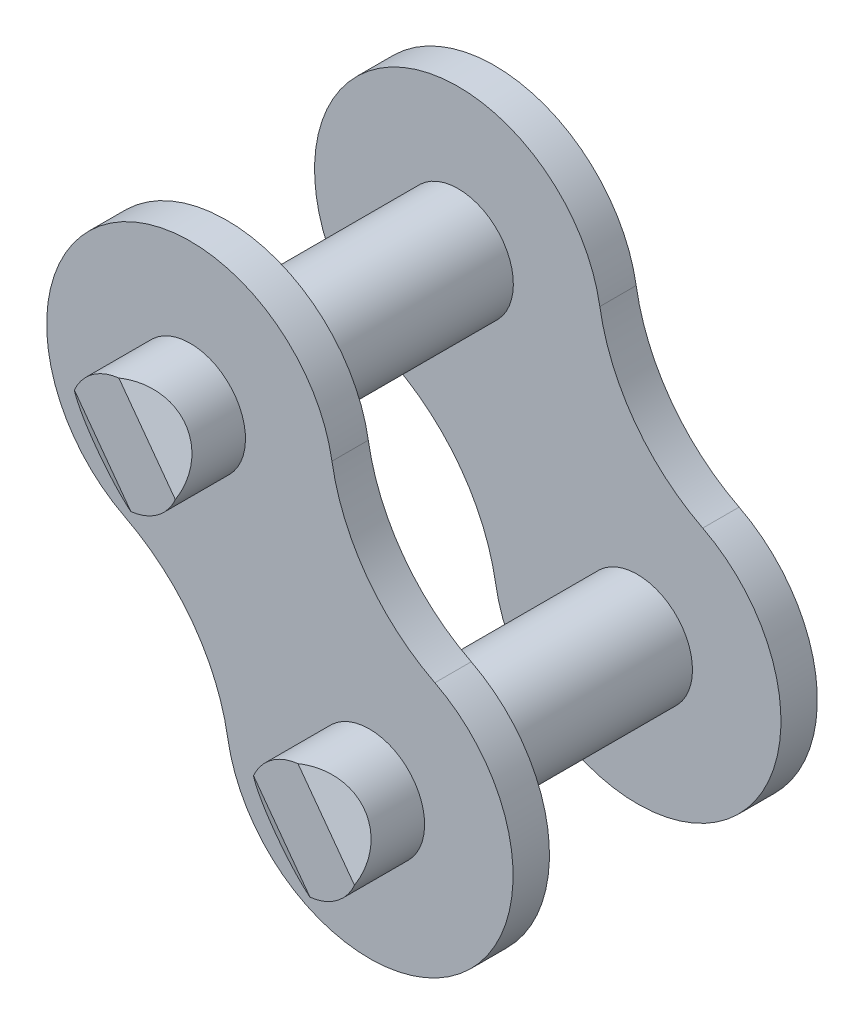
ISO-10303-21;
HEADER;
FILE_DESCRIPTION(('STEP AP214'),'2;1');
FILE_NAME('part.step','',(''),(''),'','','');
FILE_SCHEMA(('AUTOMOTIVE_DESIGN { 1 0 10303 214 1 1 1 1 }'));
ENDSEC;
DATA;
#1=APPLICATION_CONTEXT('core data for automotive mechanical design processes');
#2=APPLICATION_PROTOCOL_DEFINITION('international standard','automotive_design',2000,#1);
#3=PRODUCT_CONTEXT('',#1,'mechanical');
#4=PRODUCT('Part','Part','',(#3));
#5=PRODUCT_RELATED_PRODUCT_CATEGORY('part','',(#4));
#6=PRODUCT_DEFINITION_FORMATION('','',#4);
#7=PRODUCT_DEFINITION_CONTEXT('part definition',#1,'design');
#8=PRODUCT_DEFINITION('design','',#6,#7);
#9=PRODUCT_DEFINITION_SHAPE('','',#8);
#10=(LENGTH_UNIT() NAMED_UNIT(*) SI_UNIT(.MILLI.,.METRE.));
#11=(NAMED_UNIT(*) PLANE_ANGLE_UNIT() SI_UNIT($,.RADIAN.));
#12=(NAMED_UNIT(*) SI_UNIT($,.STERADIAN.) SOLID_ANGLE_UNIT());
#13=UNCERTAINTY_MEASURE_WITH_UNIT(LENGTH_MEASURE(1.E-05),#10,'distance_accuracy_value','');
#14=(GEOMETRIC_REPRESENTATION_CONTEXT(3) GLOBAL_UNCERTAINTY_ASSIGNED_CONTEXT((#13)) GLOBAL_UNIT_ASSIGNED_CONTEXT((#10,
#11,#12)) REPRESENTATION_CONTEXT('',''));
#15=CARTESIAN_POINT('',(0.,0.,0.));
#16=DIRECTION('',(0.,0.,1.));
#17=DIRECTION('',(1.,0.,0.));
#18=AXIS2_PLACEMENT_3D('',#15,#16,#17);
#19=CARTESIAN_POINT('',(97.5710510523382,74.9565436157474,-131.392489073474));
#20=DIRECTION('',(0.403276328607795,0.295581127247018,0.866025403784439));
#21=DIRECTION('',(0.591162254494036,-0.80655265721559,0.));
#22=AXIS2_PLACEMENT_3D('',#19,#20,#21);
#23=PLANE('',#22);
#24=CARTESIAN_POINT('',(89.6967262293112,87.1661063118109,-131.892921853051));
#25=DIRECTION('',(-0.403276328607794,-0.295581127247018,-0.866025403784439));
#26=DIRECTION('',(-0.698495090638544,-0.511961530150316,0.5));
#27=AXIS2_PLACEMENT_3D('',#24,#25,#26);
#28=ELLIPSE('',#27,1.3344874122049,1.1557);
#29=CARTESIAN_POINT('',(89.8223337167339,86.0172524268006,-131.5593));
#30=VERTEX_POINT('',#29);
#31=CARTESIAN_POINT('',(88.6389858359444,87.6317539793025,-131.5593));
#32=VERTEX_POINT('',#31);
#33=EDGE_CURVE('E275',#30,#32,#28,.T.);
#34=ORIENTED_EDGE('',*,*,#33,.T.);
#35=DIRECTION('',(-0.591162254494035,0.80655265721559,0.));
#36=VECTOR('',#35,1.);
#37=CARTESIAN_POINT('',(97.8040842788242,75.1273451701271,-131.5593));
#38=LINE('',#37,#36);
#39=EDGE_CURVE('E324',#30,#32,#38,.T.);
#40=ORIENTED_EDGE('',*,*,#39,.F.);
#41=EDGE_LOOP('',(#34,#40));
#42=FACE_BOUND('',#41,.T.);
#43=ADVANCED_FACE('F17',(#42),#23,.F.);
#44=CARTESIAN_POINT('',(98.9692504112543,75.9813529420256,-131.392489073474));
#45=DIRECTION('',(0.403276328607796,0.295581127247018,-0.866025403784438));
#46=DIRECTION('',(0.,-0.94639491673855,-0.323011859799966));
#47=AXIS2_PLACEMENT_3D('',#44,#45,#46);
#48=PLANE('',#47);
#49=CARTESIAN_POINT('',(89.6967262293112,87.1661063118109,-131.892921853051));
#50=DIRECTION('',(-0.403276328607795,-0.295581127247018,0.866025403784439));
#51=DIRECTION('',(0.698495090638544,0.511961530150315,0.5));
#52=AXIS2_PLACEMENT_3D('',#49,#50,#51);
#53=ELLIPSE('',#52,1.3344874122049,1.1557);
#54=CARTESIAN_POINT('',(90.7544666226779,86.7004586443193,-131.5593));
#55=VERTEX_POINT('',#54);
#56=CARTESIAN_POINT('',(89.5711187418885,88.3149601968213,-131.5593));
#57=VERTEX_POINT('',#56);
#58=EDGE_CURVE('E336',#55,#57,#53,.T.);
#59=ORIENTED_EDGE('',*,*,#58,.F.);
#60=DIRECTION('',(-0.591162254494035,0.80655265721559,0.));
#61=VECTOR('',#60,1.);
#62=CARTESIAN_POINT('',(98.7362171847683,75.8105513876459,-131.5593));
#63=LINE('',#62,#61);
#64=EDGE_CURVE('E327',#55,#57,#63,.T.);
#65=ORIENTED_EDGE('',*,*,#64,.T.);
#66=EDGE_LOOP('',(#59,#65));
#67=FACE_BOUND('',#66,.T.);
#68=ADVANCED_FACE('F456',(#67),#48,.T.);
#69=CARTESIAN_POINT('',(97.5710510523382,74.9565436157474,-131.392489073474));
#70=DIRECTION('',(0.403276328607795,0.295581127247018,0.866025403784439));
#71=DIRECTION('',(0.591162254494036,-0.80655265721559,0.));
#72=AXIS2_PLACEMENT_3D('',#69,#70,#71);
#73=PLANE('',#72);
#74=CARTESIAN_POINT('',(85.942845913274,92.2877156851299,-131.892921853051));
#75=DIRECTION('',(-0.403276328607794,-0.295581127247018,-0.866025403784439));
#76=DIRECTION('',(-0.698495090638544,-0.511961530150316,0.5));
#77=AXIS2_PLACEMENT_3D('',#74,#75,#76);
#78=ELLIPSE('',#77,1.3344874122049,1.1557);
#79=CARTESIAN_POINT('',(86.0684534006967,91.1388618001196,-131.5593));
#80=VERTEX_POINT('',#79);
#81=CARTESIAN_POINT('',(84.8851055199073,92.7533633526215,-131.5593));
#82=VERTEX_POINT('',#81);
#83=EDGE_CURVE('E353',#80,#82,#78,.T.);
#84=ORIENTED_EDGE('',*,*,#83,.T.);
#85=DIRECTION('',(-0.591162254494035,0.80655265721559,0.));
#86=VECTOR('',#85,1.);
#87=CARTESIAN_POINT('',(97.8040842788242,75.1273451701271,-131.5593));
#88=LINE('',#87,#86);
#89=EDGE_CURVE('E233',#80,#82,#88,.T.);
#90=ORIENTED_EDGE('',*,*,#89,.F.);
#91=EDGE_LOOP('',(#84,#90));
#92=FACE_BOUND('',#91,.T.);
#93=ADVANCED_FACE('F462',(#92),#73,.F.);
#94=CARTESIAN_POINT('',(98.9692504112543,75.9813529420256,-131.392489073474));
#95=DIRECTION('',(0.403276328607796,0.295581127247018,-0.866025403784438));
#96=DIRECTION('',(0.,-0.94639491673855,-0.323011859799966));
#97=AXIS2_PLACEMENT_3D('',#94,#95,#96);
#98=PLANE('',#97);
#99=CARTESIAN_POINT('',(85.942845913274,92.2877156851299,-131.892921853051));
#100=DIRECTION('',(-0.403276328607795,-0.295581127247018,0.866025403784439));
#101=DIRECTION('',(0.698495090638544,0.511961530150315,0.5));
#102=AXIS2_PLACEMENT_3D('',#99,#100,#101);
#103=ELLIPSE('',#102,1.3344874122049,1.1557);
#104=CARTESIAN_POINT('',(87.0005863066408,91.8220680176383,-131.5593));
#105=VERTEX_POINT('',#104);
#106=CARTESIAN_POINT('',(85.8172384258514,93.4365695701403,-131.5593));
#107=VERTEX_POINT('',#106);
#108=EDGE_CURVE('E234',#105,#107,#103,.T.);
#109=ORIENTED_EDGE('',*,*,#108,.F.);
#110=DIRECTION('',(-0.591162254494035,0.80655265721559,0.));
#111=VECTOR('',#110,1.);
#112=CARTESIAN_POINT('',(98.7362171847683,75.8105513876459,-131.5593));
#113=LINE('',#112,#111);
#114=EDGE_CURVE('E366',#105,#107,#113,.T.);
#115=ORIENTED_EDGE('',*,*,#114,.T.);
#116=EDGE_LOOP('',(#109,#115));
#117=FACE_BOUND('',#116,.T.);
#118=ADVANCED_FACE('F496',(#117),#98,.T.);
#119=CARTESIAN_POINT('',(87.8197860712926,89.7269109984704,-129.4257));
#120=DIRECTION('',(0.,0.,-1.));
#121=DIRECTION('',(0.,-1.,0.));
#122=AXIS2_PLACEMENT_3D('',#119,#120,#121);
#123=PLANE('',#122);
#124=CARTESIAN_POINT('',(89.6967262293112,87.1661063118109,-129.4257));
#125=DIRECTION('',(0.,0.,1.));
#126=DIRECTION('',(-0.591162254494035,0.80655265721559,0.));
#127=AXIS2_PLACEMENT_3D('',#124,#125,#126);
#128=CIRCLE('',#127,1.1557);
#129=CARTESIAN_POINT('',(89.0135200117924,88.098239217755,-129.4257));
#130=VERTEX_POINT('',#129);
#131=EDGE_CURVE('E309',#130,#130,#128,.T.);
#132=ORIENTED_EDGE('',*,*,#131,.F.);
#133=EDGE_LOOP('',(#132));
#134=FACE_BOUND('',#133,.T.);
#135=CARTESIAN_POINT('',(85.942845913274,92.2877156851299,-129.4257));
#136=DIRECTION('',(0.,0.,1.));
#137=DIRECTION('',(-0.591162254494035,0.80655265721559,0.));
#138=AXIS2_PLACEMENT_3D('',#135,#136,#137);
#139=CIRCLE('',#138,1.1557);
#140=CARTESIAN_POINT('',(85.2596396957552,93.219848591074,-129.4257));
#141=VERTEX_POINT('',#140);
#142=EDGE_CURVE('E323',#141,#141,#139,.T.);
#143=ORIENTED_EDGE('',*,*,#142,.F.);
#144=EDGE_LOOP('',(#143));
#145=FACE_BOUND('',#144,.T.);
#146=CARTESIAN_POINT('',(92.9188722489604,93.4642829526536,-129.4257));
#147=DIRECTION('',(0.,0.,1.));
#148=DIRECTION('',(-0.591162254494035,0.80655265721559,0.));
#149=AXIS2_PLACEMENT_3D('',#146,#147,#148);
#150=CIRCLE('',#149,4.06464973628698);
#151=CARTESIAN_POINT('',(88.9108286754961,92.788291686505,-129.4257));
#152=VERTEX_POINT('',#151);
#153=CARTESIAN_POINT('',(91.0676031990209,89.8456947772136,-129.4257));
#154=VERTEX_POINT('',#153);
#155=EDGE_CURVE('E369',#152,#154,#150,.T.);
#156=ORIENTED_EDGE('',*,*,#155,.F.);
#157=CARTESIAN_POINT('',(85.942845913274,92.2877156851299,-129.4257));
#158=DIRECTION('',(0.,0.,1.));
#159=DIRECTION('',(-0.591162254494035,0.80655265721559,0.));
#160=AXIS2_PLACEMENT_3D('',#157,#158,#159);
#161=CIRCLE('',#160,3.0099);
#162=CARTESIAN_POINT('',(84.5719689435643,89.6081272197272,-129.4257));
#163=VERTEX_POINT('',#162);
#164=EDGE_CURVE('E346',#152,#163,#161,.T.);
#165=ORIENTED_EDGE('',*,*,#164,.T.);
#166=CARTESIAN_POINT('',(82.7206998936249,85.9895390442873,-129.4257));
#167=DIRECTION('',(0.,0.,1.));
#168=DIRECTION('',(-0.591162254494035,0.80655265721559,0.));
#169=AXIS2_PLACEMENT_3D('',#166,#167,#168);
#170=CIRCLE('',#169,4.06464973628691);
#171=CARTESIAN_POINT('',(86.7287434670891,86.6655303104359,-129.4257));
#172=VERTEX_POINT('',#171);
#173=EDGE_CURVE('E216',#172,#163,#170,.T.);
#174=ORIENTED_EDGE('',*,*,#173,.F.);
#175=CARTESIAN_POINT('',(89.6967262293112,87.1661063118109,-129.4257));
#176=DIRECTION('',(0.,0.,1.));
#177=DIRECTION('',(-0.591162254494035,0.80655265721559,0.));
#178=AXIS2_PLACEMENT_3D('',#175,#176,#177);
#179=CIRCLE('',#178,3.0099);
#180=EDGE_CURVE('E20',#172,#154,#179,.T.);
#181=ORIENTED_EDGE('',*,*,#180,.T.);
#182=EDGE_LOOP('',(#156,#165,#174,#181));
#183=FACE_BOUND('',#182,.T.);
#184=ADVANCED_FACE('F398',(#134,#145,#183),#123,.F.);
#185=CARTESIAN_POINT('',(87.8197860712926,89.7269109984704,-130.1877));
#186=DIRECTION('',(0.,0.,-1.));
#187=DIRECTION('',(0.,-1.,0.));
#188=AXIS2_PLACEMENT_3D('',#185,#186,#187);
#189=PLANE('',#188);
#190=CARTESIAN_POINT('',(89.6967262293112,87.1661063118109,-130.1877));
#191=DIRECTION('',(0.,0.,1.));
#192=DIRECTION('',(-0.591162254494035,0.80655265721559,0.));
#193=AXIS2_PLACEMENT_3D('',#190,#191,#192);
#194=CIRCLE('',#193,1.1557);
#195=CARTESIAN_POINT('',(89.0135200117924,88.098239217755,-130.1877));
#196=VERTEX_POINT('',#195);
#197=EDGE_CURVE('E280',#196,#196,#194,.T.);
#198=ORIENTED_EDGE('',*,*,#197,.T.);
#199=EDGE_LOOP('',(#198));
#200=FACE_BOUND('',#199,.T.);
#201=CARTESIAN_POINT('',(85.942845913274,92.2877156851299,-130.1877));
#202=DIRECTION('',(0.,0.,1.));
#203=DIRECTION('',(-0.591162254494035,0.80655265721559,0.));
#204=AXIS2_PLACEMENT_3D('',#201,#202,#203);
#205=CIRCLE('',#204,1.1557);
#206=CARTESIAN_POINT('',(85.2596396957552,93.219848591074,-130.1877));
#207=VERTEX_POINT('',#206);
#208=EDGE_CURVE('E345',#207,#207,#205,.T.);
#209=ORIENTED_EDGE('',*,*,#208,.T.);
#210=EDGE_LOOP('',(#209));
#211=FACE_BOUND('',#210,.T.);
#212=CARTESIAN_POINT('',(92.9188722489604,93.4642829526536,-130.1877));
#213=DIRECTION('',(0.,0.,1.));
#214=DIRECTION('',(-0.591162254494035,0.80655265721559,0.));
#215=AXIS2_PLACEMENT_3D('',#212,#213,#214);
#216=CIRCLE('',#215,4.06464973628698);
#217=CARTESIAN_POINT('',(88.9108286754961,92.788291686505,-130.1877));
#218=VERTEX_POINT('',#217);
#219=CARTESIAN_POINT('',(91.0676031990209,89.8456947772136,-130.1877));
#220=VERTEX_POINT('',#219);
#221=EDGE_CURVE('E376',#218,#220,#216,.T.);
#222=ORIENTED_EDGE('',*,*,#221,.T.);
#223=CARTESIAN_POINT('',(89.6967262293112,87.1661063118109,-130.1877));
#224=DIRECTION('',(0.,0.,1.));
#225=DIRECTION('',(-0.591162254494035,0.80655265721559,0.));
#226=AXIS2_PLACEMENT_3D('',#223,#224,#225);
#227=CIRCLE('',#226,3.0099);
#228=CARTESIAN_POINT('',(86.7287434670891,86.6655303104359,-130.1877));
#229=VERTEX_POINT('',#228);
#230=EDGE_CURVE('E11',#229,#220,#227,.T.);
#231=ORIENTED_EDGE('',*,*,#230,.F.);
#232=CARTESIAN_POINT('',(82.7206998936249,85.9895390442873,-130.1877));
#233=DIRECTION('',(0.,0.,1.));
#234=DIRECTION('',(-0.591162254494035,0.80655265721559,0.));
#235=AXIS2_PLACEMENT_3D('',#232,#233,#234);
#236=CIRCLE('',#235,4.06464973628691);
#237=CARTESIAN_POINT('',(84.5719689435643,89.6081272197272,-130.1877));
#238=VERTEX_POINT('',#237);
#239=EDGE_CURVE('E385',#229,#238,#236,.T.);
#240=ORIENTED_EDGE('',*,*,#239,.T.);
#241=CARTESIAN_POINT('',(85.942845913274,92.2877156851299,-130.1877));
#242=DIRECTION('',(0.,0.,1.));
#243=DIRECTION('',(-0.591162254494035,0.80655265721559,0.));
#244=AXIS2_PLACEMENT_3D('',#241,#242,#243);
#245=CIRCLE('',#244,3.0099);
#246=EDGE_CURVE('E217',#218,#238,#245,.T.);
#247=ORIENTED_EDGE('',*,*,#246,.F.);
#248=EDGE_LOOP('',(#222,#231,#240,#247));
#249=FACE_BOUND('',#248,.T.);
#250=ADVANCED_FACE('F495',(#200,#211,#249),#189,.T.);
#251=CARTESIAN_POINT('',(89.6967262293112,87.1661063118109,-130.1877));
#252=DIRECTION('',(0.,0.,1.));
#253=DIRECTION('',(0.591162254494035,-0.80655265721559,0.));
#254=AXIS2_PLACEMENT_3D('',#251,#252,#253);
#255=CYLINDRICAL_SURFACE('',#254,3.0099);
#256=ORIENTED_EDGE('',*,*,#180,.F.);
#257=DIRECTION('',(0.,0.,1.));
#258=VECTOR('',#257,1.);
#259=CARTESIAN_POINT('',(86.7287434670891,86.6655303104359,-130.1877));
#260=LINE('',#259,#258);
#261=EDGE_CURVE('E387',#229,#172,#260,.T.);
#262=ORIENTED_EDGE('',*,*,#261,.F.);
#263=ORIENTED_EDGE('',*,*,#230,.T.);
#264=DIRECTION('',(0.,0.,1.));
#265=VECTOR('',#264,1.);
#266=CARTESIAN_POINT('',(91.0676031990209,89.8456947772136,-130.1877));
#267=LINE('',#266,#265);
#268=EDGE_CURVE('E373',#220,#154,#267,.T.);
#269=ORIENTED_EDGE('',*,*,#268,.T.);
#270=EDGE_LOOP('',(#256,#262,#263,#269));
#271=FACE_BOUND('',#270,.T.);
#272=ADVANCED_FACE('F400',(#271),#255,.T.);
#273=CARTESIAN_POINT('',(82.7206998936249,85.9895390442873,-130.1877));
#274=DIRECTION('',(0.,0.,1.));
#275=DIRECTION('',(0.591162254494035,-0.80655265721559,0.));
#276=AXIS2_PLACEMENT_3D('',#273,#274,#275);
#277=CYLINDRICAL_SURFACE('',#276,4.06464973628691);
#278=ORIENTED_EDGE('',*,*,#173,.T.);
#279=DIRECTION('',(0.,0.,1.));
#280=VECTOR('',#279,1.);
#281=CARTESIAN_POINT('',(84.5719689435643,89.6081272197272,-130.1877));
#282=LINE('',#281,#280);
#283=EDGE_CURVE('E214',#238,#163,#282,.T.);
#284=ORIENTED_EDGE('',*,*,#283,.F.);
#285=ORIENTED_EDGE('',*,*,#239,.F.);
#286=ORIENTED_EDGE('',*,*,#261,.T.);
#287=EDGE_LOOP('',(#278,#284,#285,#286));
#288=FACE_BOUND('',#287,.T.);
#289=ADVANCED_FACE('F408',(#288),#277,.F.);
#290=CARTESIAN_POINT('',(85.942845913274,92.2877156851299,-130.1877));
#291=DIRECTION('',(0.,0.,1.));
#292=DIRECTION('',(0.591162254494035,-0.80655265721559,0.));
#293=AXIS2_PLACEMENT_3D('',#290,#291,#292);
#294=CYLINDRICAL_SURFACE('',#293,3.0099);
#295=ORIENTED_EDGE('',*,*,#164,.F.);
#296=DIRECTION('',(0.,0.,1.));
#297=VECTOR('',#296,1.);
#298=CARTESIAN_POINT('',(88.9108286754961,92.788291686505,-130.1877));
#299=LINE('',#298,#297);
#300=EDGE_CURVE('E350',#218,#152,#299,.T.);
#301=ORIENTED_EDGE('',*,*,#300,.F.);
#302=ORIENTED_EDGE('',*,*,#246,.T.);
#303=ORIENTED_EDGE('',*,*,#283,.T.);
#304=EDGE_LOOP('',(#295,#301,#302,#303));
#305=FACE_BOUND('',#304,.T.);
#306=ADVANCED_FACE('F406',(#305),#294,.T.);
#307=CARTESIAN_POINT('',(92.9188722489604,93.4642829526536,-130.1877));
#308=DIRECTION('',(0.,0.,1.));
#309=DIRECTION('',(0.591162254494035,-0.80655265721559,0.));
#310=AXIS2_PLACEMENT_3D('',#307,#308,#309);
#311=CYLINDRICAL_SURFACE('',#310,4.06464973628698);
#312=ORIENTED_EDGE('',*,*,#155,.T.);
#313=ORIENTED_EDGE('',*,*,#268,.F.);
#314=ORIENTED_EDGE('',*,*,#221,.F.);
#315=ORIENTED_EDGE('',*,*,#300,.T.);
#316=EDGE_LOOP('',(#312,#313,#314,#315));
#317=FACE_BOUND('',#316,.T.);
#318=ADVANCED_FACE('F403',(#317),#311,.F.);
#319=CARTESIAN_POINT('',(87.8197860712926,89.7269109984704,-131.5593));
#320=DIRECTION('',(0.,0.,-1.));
#321=DIRECTION('',(0.,-1.,0.));
#322=AXIS2_PLACEMENT_3D('',#319,#320,#321);
#323=PLANE('',#322);
#324=ORIENTED_EDGE('',*,*,#89,.T.);
#325=CARTESIAN_POINT('',(85.942845913274,92.2877156851299,-131.5593));
#326=DIRECTION('',(0.,0.,1.));
#327=DIRECTION('',(-0.591162254494035,0.80655265721559,0.));
#328=AXIS2_PLACEMENT_3D('',#325,#326,#327);
#329=CIRCLE('',#328,1.1557);
#330=EDGE_CURVE('E229',#107,#82,#329,.T.);
#331=ORIENTED_EDGE('',*,*,#330,.F.);
#332=ORIENTED_EDGE('',*,*,#114,.F.);
#333=CARTESIAN_POINT('',(85.942845913274,92.2877156851299,-131.5593));
#334=DIRECTION('',(0.,0.,1.));
#335=DIRECTION('',(-0.591162254494035,0.80655265721559,0.));
#336=AXIS2_PLACEMENT_3D('',#333,#334,#335);
#337=CIRCLE('',#336,1.1557);
#338=EDGE_CURVE('E357',#80,#105,#337,.T.);
#339=ORIENTED_EDGE('',*,*,#338,.F.);
#340=EDGE_LOOP('',(#324,#331,#332,#339));
#341=FACE_BOUND('',#340,.T.);
#342=ADVANCED_FACE('F482',(#341),#323,.T.);
#343=CARTESIAN_POINT('',(85.942845913274,92.2877156851299,-131.5593));
#344=DIRECTION('',(0.,0.,1.));
#345=DIRECTION('',(0.591162254494035,-0.80655265721559,0.));
#346=AXIS2_PLACEMENT_3D('',#343,#344,#345);
#347=CYLINDRICAL_SURFACE('',#346,1.1557);
#348=ORIENTED_EDGE('',*,*,#83,.F.);
#349=ORIENTED_EDGE('',*,*,#338,.T.);
#350=ORIENTED_EDGE('',*,*,#108,.T.);
#351=ORIENTED_EDGE('',*,*,#330,.T.);
#352=EDGE_LOOP('',(#348,#349,#350,#351));
#353=FACE_BOUND('',#352,.T.);
#354=ORIENTED_EDGE('',*,*,#208,.F.);
#355=EDGE_LOOP('',(#354));
#356=FACE_BOUND('',#355,.T.);
#357=ADVANCED_FACE('F474',(#353,#356),#347,.T.);
#358=CARTESIAN_POINT('',(87.8197860712926,89.7269109984704,-131.5593));
#359=DIRECTION('',(0.,0.,-1.));
#360=DIRECTION('',(0.,-1.,0.));
#361=AXIS2_PLACEMENT_3D('',#358,#359,#360);
#362=PLANE('',#361);
#363=ORIENTED_EDGE('',*,*,#39,.T.);
#364=CARTESIAN_POINT('',(89.6967262293112,87.1661063118109,-131.5593));
#365=DIRECTION('',(0.,0.,1.));
#366=DIRECTION('',(-0.591162254494035,0.80655265721559,0.));
#367=AXIS2_PLACEMENT_3D('',#364,#365,#366);
#368=CIRCLE('',#367,1.1557);
#369=EDGE_CURVE('E328',#57,#32,#368,.T.);
#370=ORIENTED_EDGE('',*,*,#369,.F.);
#371=ORIENTED_EDGE('',*,*,#64,.F.);
#372=CARTESIAN_POINT('',(89.6967262293112,87.1661063118109,-131.5593));
#373=DIRECTION('',(0.,0.,1.));
#374=DIRECTION('',(-0.591162254494035,0.80655265721559,0.));
#375=AXIS2_PLACEMENT_3D('',#372,#373,#374);
#376=CIRCLE('',#375,1.1557);
#377=EDGE_CURVE('E279',#30,#55,#376,.T.);
#378=ORIENTED_EDGE('',*,*,#377,.F.);
#379=EDGE_LOOP('',(#363,#370,#371,#378));
#380=FACE_BOUND('',#379,.T.);
#381=ADVANCED_FACE('F472',(#380),#362,.T.);
#382=CARTESIAN_POINT('',(89.6967262293112,87.1661063118109,-131.5593));
#383=DIRECTION('',(0.,0.,1.));
#384=DIRECTION('',(0.591162254494035,-0.80655265721559,0.));
#385=AXIS2_PLACEMENT_3D('',#382,#383,#384);
#386=CYLINDRICAL_SURFACE('',#385,1.1557);
#387=ORIENTED_EDGE('',*,*,#33,.F.);
#388=ORIENTED_EDGE('',*,*,#377,.T.);
#389=ORIENTED_EDGE('',*,*,#58,.T.);
#390=ORIENTED_EDGE('',*,*,#369,.T.);
#391=EDGE_LOOP('',(#387,#388,#389,#390));
#392=FACE_BOUND('',#391,.T.);
#393=ORIENTED_EDGE('',*,*,#197,.F.);
#394=EDGE_LOOP('',(#393));
#395=FACE_BOUND('',#394,.T.);
#396=ADVANCED_FACE('F467',(#392,#395),#386,.T.);
#397=CARTESIAN_POINT('',(97.5710510523382,74.9565436157474,-122.607510926526));
#398=DIRECTION('',(0.403276328607795,0.295581127247018,-0.866025403784439));
#399=DIRECTION('',(0.,-0.94639491673855,-0.323011859799966));
#400=AXIS2_PLACEMENT_3D('',#397,#398,#399);
#401=PLANE('',#400);
#402=CARTESIAN_POINT('',(89.6967262293112,87.1661063118109,-122.107078146949));
#403=DIRECTION('',(0.403276328607794,0.295581127247018,-0.866025403784439));
#404=DIRECTION('',(-0.698495090638544,-0.511961530150316,-0.5));
#405=AXIS2_PLACEMENT_3D('',#402,#403,#404);
#406=ELLIPSE('',#405,1.3344874122049,1.1557);
#407=CARTESIAN_POINT('',(89.8223337167339,86.0172524268006,-122.4407));
#408=VERTEX_POINT('',#407);
#409=CARTESIAN_POINT('',(88.6389858359444,87.6317539793025,-122.4407));
#410=VERTEX_POINT('',#409);
#411=EDGE_CURVE('E201',#408,#410,#406,.T.);
#412=ORIENTED_EDGE('',*,*,#411,.F.);
#413=DIRECTION('',(-0.591162254494035,0.80655265721559,0.));
#414=VECTOR('',#413,1.);
#415=CARTESIAN_POINT('',(97.8040842788242,75.1273451701271,-122.4407));
#416=LINE('',#415,#414);
#417=EDGE_CURVE('E248',#408,#410,#416,.T.);
#418=ORIENTED_EDGE('',*,*,#417,.T.);
#419=EDGE_LOOP('',(#412,#418));
#420=FACE_BOUND('',#419,.T.);
#421=ADVANCED_FACE('F480',(#420),#401,.F.);
#422=CARTESIAN_POINT('',(98.9692504112543,75.9813529420256,-122.607510926526));
#423=DIRECTION('',(0.403276328607796,0.295581127247018,0.866025403784438));
#424=DIRECTION('',(0.591162254494035,-0.806552657215591,0.));
#425=AXIS2_PLACEMENT_3D('',#422,#423,#424);
#426=PLANE('',#425);
#427=CARTESIAN_POINT('',(89.6967262293112,87.1661063118109,-122.107078146949));
#428=DIRECTION('',(0.403276328607795,0.295581127247018,0.866025403784439));
#429=DIRECTION('',(0.698495090638544,0.511961530150315,-0.5));
#430=AXIS2_PLACEMENT_3D('',#427,#428,#429);
#431=ELLIPSE('',#430,1.3344874122049,1.1557);
#432=CARTESIAN_POINT('',(90.7544666226779,86.7004586443193,-122.4407));
#433=VERTEX_POINT('',#432);
#434=CARTESIAN_POINT('',(89.5711187418885,88.3149601968213,-122.4407));
#435=VERTEX_POINT('',#434);
#436=EDGE_CURVE('E228',#433,#435,#431,.T.);
#437=ORIENTED_EDGE('',*,*,#436,.T.);
#438=DIRECTION('',(-0.591162254494035,0.80655265721559,0.));
#439=VECTOR('',#438,1.);
#440=CARTESIAN_POINT('',(98.7362171847683,75.8105513876459,-122.4407));
#441=LINE('',#440,#439);
#442=EDGE_CURVE('E251',#433,#435,#441,.T.);
#443=ORIENTED_EDGE('',*,*,#442,.F.);
#444=EDGE_LOOP('',(#437,#443));
#445=FACE_BOUND('',#444,.T.);
#446=ADVANCED_FACE('F530',(#445),#426,.T.);
#447=CARTESIAN_POINT('',(97.5710510523382,74.9565436157474,-122.607510926526));
#448=DIRECTION('',(0.403276328607795,0.295581127247018,-0.866025403784439));
#449=DIRECTION('',(0.,-0.94639491673855,-0.323011859799966));
#450=AXIS2_PLACEMENT_3D('',#447,#448,#449);
#451=PLANE('',#450);
#452=CARTESIAN_POINT('',(85.942845913274,92.2877156851299,-122.107078146949));
#453=DIRECTION('',(0.403276328607794,0.295581127247018,-0.866025403784439));
#454=DIRECTION('',(-0.698495090638544,-0.511961530150316,-0.5));
#455=AXIS2_PLACEMENT_3D('',#452,#453,#454);
#456=ELLIPSE('',#455,1.3344874122049,1.1557);
#457=CARTESIAN_POINT('',(86.0684534006967,91.1388618001196,-122.4407));
#458=VERTEX_POINT('',#457);
#459=CARTESIAN_POINT('',(84.8851055199073,92.7533633526215,-122.4407));
#460=VERTEX_POINT('',#459);
#461=EDGE_CURVE('E224',#458,#460,#456,.T.);
#462=ORIENTED_EDGE('',*,*,#461,.F.);
#463=DIRECTION('',(-0.591162254494035,0.80655265721559,0.));
#464=VECTOR('',#463,1.);
#465=CARTESIAN_POINT('',(97.8040842788242,75.1273451701271,-122.4407));
#466=LINE('',#465,#464);
#467=EDGE_CURVE('E273',#458,#460,#466,.T.);
#468=ORIENTED_EDGE('',*,*,#467,.T.);
#469=EDGE_LOOP('',(#462,#468));
#470=FACE_BOUND('',#469,.T.);
#471=ADVANCED_FACE('F539',(#470),#451,.F.);
#472=CARTESIAN_POINT('',(98.9692504112543,75.9813529420256,-122.607510926526));
#473=DIRECTION('',(0.403276328607796,0.295581127247018,0.866025403784438));
#474=DIRECTION('',(0.591162254494035,-0.806552657215591,0.));
#475=AXIS2_PLACEMENT_3D('',#472,#473,#474);
#476=PLANE('',#475);
#477=CARTESIAN_POINT('',(85.942845913274,92.2877156851299,-122.107078146949));
#478=DIRECTION('',(0.403276328607795,0.295581127247018,0.866025403784439));
#479=DIRECTION('',(0.698495090638544,0.511961530150315,-0.5));
#480=AXIS2_PLACEMENT_3D('',#477,#478,#479);
#481=ELLIPSE('',#480,1.3344874122049,1.1557);
#482=CARTESIAN_POINT('',(87.0005863066408,91.8220680176383,-122.4407));
#483=VERTEX_POINT('',#482);
#484=CARTESIAN_POINT('',(85.8172384258514,93.4365695701403,-122.4407));
#485=VERTEX_POINT('',#484);
#486=EDGE_CURVE('E223',#483,#485,#481,.T.);
#487=ORIENTED_EDGE('',*,*,#486,.T.);
#488=DIRECTION('',(-0.591162254494035,0.80655265721559,0.));
#489=VECTOR('',#488,1.);
#490=CARTESIAN_POINT('',(98.7362171847683,75.8105513876459,-122.4407));
#491=LINE('',#490,#489);
#492=EDGE_CURVE('E240',#483,#485,#491,.T.);
#493=ORIENTED_EDGE('',*,*,#492,.F.);
#494=EDGE_LOOP('',(#487,#493));
#495=FACE_BOUND('',#494,.T.);
#496=ADVANCED_FACE('F535',(#495),#476,.T.);
#497=CARTESIAN_POINT('',(89.6967262293112,87.1661063118109,-122.4407));
#498=DIRECTION('',(0.,0.,-1.));
#499=DIRECTION('',(0.591162254494035,-0.80655265721559,0.));
#500=AXIS2_PLACEMENT_3D('',#497,#498,#499);
#501=CYLINDRICAL_SURFACE('',#500,1.1557);
#502=ORIENTED_EDGE('',*,*,#131,.T.);
#503=EDGE_LOOP('',(#502));
#504=FACE_BOUND('',#503,.T.);
#505=CARTESIAN_POINT('',(89.6967262293112,87.1661063118109,-124.5743));
#506=DIRECTION('',(0.,0.,1.));
#507=DIRECTION('',(-0.591162254494035,0.80655265721559,0.));
#508=AXIS2_PLACEMENT_3D('',#505,#506,#507);
#509=CIRCLE('',#508,1.1557);
#510=CARTESIAN_POINT('',(89.0135200117924,88.098239217755,-124.5743));
#511=VERTEX_POINT('',#510);
#512=EDGE_CURVE('E320',#511,#511,#509,.T.);
#513=ORIENTED_EDGE('',*,*,#512,.F.);
#514=EDGE_LOOP('',(#513));
#515=FACE_BOUND('',#514,.T.);
#516=ADVANCED_FACE('F449',(#504,#515),#501,.T.);
#517=CARTESIAN_POINT('',(85.942845913274,92.2877156851299,-122.4407));
#518=DIRECTION('',(0.,0.,-1.));
#519=DIRECTION('',(0.591162254494035,-0.80655265721559,0.));
#520=AXIS2_PLACEMENT_3D('',#517,#518,#519);
#521=CYLINDRICAL_SURFACE('',#520,1.1557);
#522=ORIENTED_EDGE('',*,*,#142,.T.);
#523=EDGE_LOOP('',(#522));
#524=FACE_BOUND('',#523,.T.);
#525=CARTESIAN_POINT('',(85.942845913274,92.2877156851299,-124.5743));
#526=DIRECTION('',(0.,0.,1.));
#527=DIRECTION('',(-0.591162254494035,0.80655265721559,0.));
#528=AXIS2_PLACEMENT_3D('',#525,#526,#527);
#529=CIRCLE('',#528,1.1557);
#530=CARTESIAN_POINT('',(85.2596396957552,93.219848591074,-124.5743));
#531=VERTEX_POINT('',#530);
#532=EDGE_CURVE('E284',#531,#531,#529,.T.);
#533=ORIENTED_EDGE('',*,*,#532,.F.);
#534=EDGE_LOOP('',(#533));
#535=FACE_BOUND('',#534,.T.);
#536=ADVANCED_FACE('F441',(#524,#535),#521,.T.);
#537=CARTESIAN_POINT('',(87.8197860712926,89.7269109984704,-124.5743));
#538=DIRECTION('',(0.,0.,1.));
#539=DIRECTION('',(1.,0.,0.));
#540=AXIS2_PLACEMENT_3D('',#537,#538,#539);
#541=PLANE('',#540);
#542=ORIENTED_EDGE('',*,*,#512,.T.);
#543=EDGE_LOOP('',(#542));
#544=FACE_BOUND('',#543,.T.);
#545=ORIENTED_EDGE('',*,*,#532,.T.);
#546=EDGE_LOOP('',(#545));
#547=FACE_BOUND('',#546,.T.);
#548=CARTESIAN_POINT('',(92.9188722489604,93.4642829526536,-124.5743));
#549=DIRECTION('',(0.,0.,1.));
#550=DIRECTION('',(-0.591162254494035,0.80655265721559,0.));
#551=AXIS2_PLACEMENT_3D('',#548,#549,#550);
#552=CIRCLE('',#551,4.06464973628698);
#553=CARTESIAN_POINT('',(88.9108286754961,92.788291686505,-124.5743));
#554=VERTEX_POINT('',#553);
#555=CARTESIAN_POINT('',(91.0676031990209,89.8456947772136,-124.5743));
#556=VERTEX_POINT('',#555);
#557=EDGE_CURVE('E235',#554,#556,#552,.T.);
#558=ORIENTED_EDGE('',*,*,#557,.T.);
#559=CARTESIAN_POINT('',(89.6967262293112,87.1661063118109,-124.5743));
#560=DIRECTION('',(0.,0.,1.));
#561=DIRECTION('',(-0.591162254494035,0.80655265721559,0.));
#562=AXIS2_PLACEMENT_3D('',#559,#560,#561);
#563=CIRCLE('',#562,3.0099);
#564=CARTESIAN_POINT('',(86.7287434670891,86.6655303104359,-124.5743));
#565=VERTEX_POINT('',#564);
#566=EDGE_CURVE('E285',#565,#556,#563,.T.);
#567=ORIENTED_EDGE('',*,*,#566,.F.);
#568=CARTESIAN_POINT('',(82.7206998936249,85.9895390442873,-124.5743));
#569=DIRECTION('',(0.,0.,1.));
#570=DIRECTION('',(-0.591162254494035,0.80655265721559,0.));
#571=AXIS2_PLACEMENT_3D('',#568,#569,#570);
#572=CIRCLE('',#571,4.06464973628691);
#573=CARTESIAN_POINT('',(84.5719689435643,89.6081272197272,-124.5743));
#574=VERTEX_POINT('',#573);
#575=EDGE_CURVE('E303',#565,#574,#572,.T.);
#576=ORIENTED_EDGE('',*,*,#575,.T.);
#577=CARTESIAN_POINT('',(85.942845913274,92.2877156851299,-124.5743));
#578=DIRECTION('',(0.,0.,1.));
#579=DIRECTION('',(-0.591162254494035,0.80655265721559,0.));
#580=AXIS2_PLACEMENT_3D('',#577,#578,#579);
#581=CIRCLE('',#580,3.0099);
#582=EDGE_CURVE('E252',#554,#574,#581,.T.);
#583=ORIENTED_EDGE('',*,*,#582,.F.);
#584=EDGE_LOOP('',(#558,#567,#576,#583));
#585=FACE_BOUND('',#584,.T.);
#586=ADVANCED_FACE('F422',(#544,#547,#585),#541,.F.);
#587=CARTESIAN_POINT('',(87.8197860712926,89.7269109984704,-123.8123));
#588=DIRECTION('',(0.,0.,1.));
#589=DIRECTION('',(1.,0.,0.));
#590=AXIS2_PLACEMENT_3D('',#587,#588,#589);
#591=PLANE('',#590);
#592=CARTESIAN_POINT('',(89.6967262293112,87.1661063118109,-123.8123));
#593=DIRECTION('',(0.,0.,1.));
#594=DIRECTION('',(-0.591162254494035,0.80655265721559,0.));
#595=AXIS2_PLACEMENT_3D('',#592,#593,#594);
#596=CIRCLE('',#595,1.1557);
#597=CARTESIAN_POINT('',(89.0135200117924,88.098239217755,-123.8123));
#598=VERTEX_POINT('',#597);
#599=EDGE_CURVE('E197',#598,#598,#596,.T.);
#600=ORIENTED_EDGE('',*,*,#599,.F.);
#601=EDGE_LOOP('',(#600));
#602=FACE_BOUND('',#601,.T.);
#603=CARTESIAN_POINT('',(85.942845913274,92.2877156851299,-123.8123));
#604=DIRECTION('',(0.,0.,1.));
#605=DIRECTION('',(-0.591162254494035,0.80655265721559,0.));
#606=AXIS2_PLACEMENT_3D('',#603,#604,#605);
#607=CIRCLE('',#606,1.1557);
#608=CARTESIAN_POINT('',(85.2596396957552,93.219848591074,-123.8123));
#609=VERTEX_POINT('',#608);
#610=EDGE_CURVE('E212',#609,#609,#607,.T.);
#611=ORIENTED_EDGE('',*,*,#610,.F.);
#612=EDGE_LOOP('',(#611));
#613=FACE_BOUND('',#612,.T.);
#614=CARTESIAN_POINT('',(92.9188722489604,93.4642829526536,-123.8123));
#615=DIRECTION('',(0.,0.,1.));
#616=DIRECTION('',(-0.591162254494035,0.80655265721559,0.));
#617=AXIS2_PLACEMENT_3D('',#614,#615,#616);
#618=CIRCLE('',#617,4.06464973628698);
#619=CARTESIAN_POINT('',(88.9108286754961,92.788291686505,-123.8123));
#620=VERTEX_POINT('',#619);
#621=CARTESIAN_POINT('',(91.0676031990209,89.8456947772136,-123.8123));
#622=VERTEX_POINT('',#621);
#623=EDGE_CURVE('E266',#620,#622,#618,.T.);
#624=ORIENTED_EDGE('',*,*,#623,.F.);
#625=CARTESIAN_POINT('',(85.942845913274,92.2877156851299,-123.8123));
#626=DIRECTION('',(0.,0.,1.));
#627=DIRECTION('',(-0.591162254494035,0.80655265721559,0.));
#628=AXIS2_PLACEMENT_3D('',#625,#626,#627);
#629=CIRCLE('',#628,3.0099);
#630=CARTESIAN_POINT('',(84.5719689435643,89.6081272197272,-123.8123));
#631=VERTEX_POINT('',#630);
#632=EDGE_CURVE('E299',#620,#631,#629,.T.);
#633=ORIENTED_EDGE('',*,*,#632,.T.);
#634=CARTESIAN_POINT('',(82.7206998936249,85.9895390442873,-123.8123));
#635=DIRECTION('',(0.,0.,1.));
#636=DIRECTION('',(-0.591162254494035,0.80655265721559,0.));
#637=AXIS2_PLACEMENT_3D('',#634,#635,#636);
#638=CIRCLE('',#637,4.06464973628691);
#639=CARTESIAN_POINT('',(86.7287434670891,86.6655303104359,-123.8123));
#640=VERTEX_POINT('',#639);
#641=EDGE_CURVE('E313',#640,#631,#638,.T.);
#642=ORIENTED_EDGE('',*,*,#641,.F.);
#643=CARTESIAN_POINT('',(89.6967262293112,87.1661063118109,-123.8123));
#644=DIRECTION('',(0.,0.,1.));
#645=DIRECTION('',(-0.591162254494035,0.80655265721559,0.));
#646=AXIS2_PLACEMENT_3D('',#643,#644,#645);
#647=CIRCLE('',#646,3.0099);
#648=EDGE_CURVE('E281',#640,#622,#647,.T.);
#649=ORIENTED_EDGE('',*,*,#648,.T.);
#650=EDGE_LOOP('',(#624,#633,#642,#649));
#651=FACE_BOUND('',#650,.T.);
#652=ADVANCED_FACE('F418',(#602,#613,#651),#591,.T.);
#653=CARTESIAN_POINT('',(89.6967262293112,87.1661063118109,-123.8123));
#654=DIRECTION('',(0.,0.,-1.));
#655=DIRECTION('',(0.591162254494035,-0.80655265721559,0.));
#656=AXIS2_PLACEMENT_3D('',#653,#654,#655);
#657=CYLINDRICAL_SURFACE('',#656,3.0099);
#658=ORIENTED_EDGE('',*,*,#566,.T.);
#659=DIRECTION('',(0.,0.,-1.));
#660=VECTOR('',#659,1.);
#661=CARTESIAN_POINT('',(91.0676031990209,89.8456947772136,-123.8123));
#662=LINE('',#661,#660);
#663=EDGE_CURVE('E257',#622,#556,#662,.T.);
#664=ORIENTED_EDGE('',*,*,#663,.F.);
#665=ORIENTED_EDGE('',*,*,#648,.F.);
#666=DIRECTION('',(0.,0.,-1.));
#667=VECTOR('',#666,1.);
#668=CARTESIAN_POINT('',(86.7287434670891,86.6655303104359,-123.8123));
#669=LINE('',#668,#667);
#670=EDGE_CURVE('E306',#640,#565,#669,.T.);
#671=ORIENTED_EDGE('',*,*,#670,.T.);
#672=EDGE_LOOP('',(#658,#664,#665,#671));
#673=FACE_BOUND('',#672,.T.);
#674=ADVANCED_FACE('F421',(#673),#657,.T.);
#675=CARTESIAN_POINT('',(82.7206998936249,85.9895390442873,-123.8123));
#676=DIRECTION('',(0.,0.,-1.));
#677=DIRECTION('',(0.591162254494035,-0.80655265721559,0.));
#678=AXIS2_PLACEMENT_3D('',#675,#676,#677);
#679=CYLINDRICAL_SURFACE('',#678,4.06464973628691);
#680=ORIENTED_EDGE('',*,*,#575,.F.);
#681=ORIENTED_EDGE('',*,*,#670,.F.);
#682=ORIENTED_EDGE('',*,*,#641,.T.);
#683=DIRECTION('',(0.,0.,-1.));
#684=VECTOR('',#683,1.);
#685=CARTESIAN_POINT('',(84.5719689435643,89.6081272197272,-123.8123));
#686=LINE('',#685,#684);
#687=EDGE_CURVE('E256',#631,#574,#686,.T.);
#688=ORIENTED_EDGE('',*,*,#687,.T.);
#689=EDGE_LOOP('',(#680,#681,#682,#688));
#690=FACE_BOUND('',#689,.T.);
#691=ADVANCED_FACE('F436',(#690),#679,.F.);
#692=CARTESIAN_POINT('',(85.942845913274,92.2877156851299,-123.8123));
#693=DIRECTION('',(0.,0.,-1.));
#694=DIRECTION('',(0.591162254494035,-0.80655265721559,0.));
#695=AXIS2_PLACEMENT_3D('',#692,#693,#694);
#696=CYLINDRICAL_SURFACE('',#695,3.0099);
#697=ORIENTED_EDGE('',*,*,#582,.T.);
#698=ORIENTED_EDGE('',*,*,#687,.F.);
#699=ORIENTED_EDGE('',*,*,#632,.F.);
#700=DIRECTION('',(0.,0.,-1.));
#701=VECTOR('',#700,1.);
#702=CARTESIAN_POINT('',(88.9108286754961,92.788291686505,-123.8123));
#703=LINE('',#702,#701);
#704=EDGE_CURVE('E239',#620,#554,#703,.T.);
#705=ORIENTED_EDGE('',*,*,#704,.T.);
#706=EDGE_LOOP('',(#697,#698,#699,#705));
#707=FACE_BOUND('',#706,.T.);
#708=ADVANCED_FACE('F433',(#707),#696,.T.);
#709=CARTESIAN_POINT('',(92.9188722489604,93.4642829526536,-123.8123));
#710=DIRECTION('',(0.,0.,-1.));
#711=DIRECTION('',(0.591162254494035,-0.80655265721559,0.));
#712=AXIS2_PLACEMENT_3D('',#709,#710,#711);
#713=CYLINDRICAL_SURFACE('',#712,4.06464973628698);
#714=ORIENTED_EDGE('',*,*,#557,.F.);
#715=ORIENTED_EDGE('',*,*,#704,.F.);
#716=ORIENTED_EDGE('',*,*,#623,.T.);
#717=ORIENTED_EDGE('',*,*,#663,.T.);
#718=EDGE_LOOP('',(#714,#715,#716,#717));
#719=FACE_BOUND('',#718,.T.);
#720=ADVANCED_FACE('F431',(#719),#713,.F.);
#721=CARTESIAN_POINT('',(87.8197860712926,89.7269109984704,-122.4407));
#722=DIRECTION('',(0.,0.,1.));
#723=DIRECTION('',(1.,0.,0.));
#724=AXIS2_PLACEMENT_3D('',#721,#722,#723);
#725=PLANE('',#724);
#726=ORIENTED_EDGE('',*,*,#467,.F.);
#727=CARTESIAN_POINT('',(85.942845913274,92.2877156851299,-122.4407));
#728=DIRECTION('',(0.,0.,1.));
#729=DIRECTION('',(-0.591162254494035,0.80655265721559,0.));
#730=AXIS2_PLACEMENT_3D('',#727,#728,#729);
#731=CIRCLE('',#730,1.1557);
#732=EDGE_CURVE('E270',#458,#483,#731,.T.);
#733=ORIENTED_EDGE('',*,*,#732,.T.);
#734=ORIENTED_EDGE('',*,*,#492,.T.);
#735=CARTESIAN_POINT('',(85.942845913274,92.2877156851299,-122.4407));
#736=DIRECTION('',(0.,0.,1.));
#737=DIRECTION('',(-0.591162254494035,0.80655265721559,0.));
#738=AXIS2_PLACEMENT_3D('',#735,#736,#737);
#739=CIRCLE('',#738,1.1557);
#740=EDGE_CURVE('E219',#485,#460,#739,.T.);
#741=ORIENTED_EDGE('',*,*,#740,.T.);
#742=EDGE_LOOP('',(#726,#733,#734,#741));
#743=FACE_BOUND('',#742,.T.);
#744=ADVANCED_FACE('F524',(#743),#725,.T.);
#745=CARTESIAN_POINT('',(85.942845913274,92.2877156851299,-122.4407));
#746=DIRECTION('',(0.,0.,-1.));
#747=DIRECTION('',(0.591162254494035,-0.80655265721559,0.));
#748=AXIS2_PLACEMENT_3D('',#745,#746,#747);
#749=CYLINDRICAL_SURFACE('',#748,1.1557);
#750=ORIENTED_EDGE('',*,*,#461,.T.);
#751=ORIENTED_EDGE('',*,*,#740,.F.);
#752=ORIENTED_EDGE('',*,*,#486,.F.);
#753=ORIENTED_EDGE('',*,*,#732,.F.);
#754=EDGE_LOOP('',(#750,#751,#752,#753));
#755=FACE_BOUND('',#754,.T.);
#756=ORIENTED_EDGE('',*,*,#610,.T.);
#757=EDGE_LOOP('',(#756));
#758=FACE_BOUND('',#757,.T.);
#759=ADVANCED_FACE('F416',(#755,#758),#749,.T.);
#760=CARTESIAN_POINT('',(87.8197860712926,89.7269109984704,-122.4407));
#761=DIRECTION('',(0.,0.,1.));
#762=DIRECTION('',(1.,0.,0.));
#763=AXIS2_PLACEMENT_3D('',#760,#761,#762);
#764=PLANE('',#763);
#765=ORIENTED_EDGE('',*,*,#417,.F.);
#766=CARTESIAN_POINT('',(89.6967262293112,87.1661063118109,-122.4407));
#767=DIRECTION('',(0.,0.,1.));
#768=DIRECTION('',(-0.591162254494035,0.80655265721559,0.));
#769=AXIS2_PLACEMENT_3D('',#766,#767,#768);
#770=CIRCLE('',#769,1.1557);
#771=EDGE_CURVE('E244',#408,#433,#770,.T.);
#772=ORIENTED_EDGE('',*,*,#771,.T.);
#773=ORIENTED_EDGE('',*,*,#442,.T.);
#774=CARTESIAN_POINT('',(89.6967262293112,87.1661063118109,-122.4407));
#775=DIRECTION('',(0.,0.,1.));
#776=DIRECTION('',(-0.591162254494035,0.80655265721559,0.));
#777=AXIS2_PLACEMENT_3D('',#774,#775,#776);
#778=CIRCLE('',#777,1.1557);
#779=EDGE_CURVE('E208',#435,#410,#778,.T.);
#780=ORIENTED_EDGE('',*,*,#779,.T.);
#781=EDGE_LOOP('',(#765,#772,#773,#780));
#782=FACE_BOUND('',#781,.T.);
#783=ADVANCED_FACE('F558',(#782),#764,.T.);
#784=CARTESIAN_POINT('',(89.6967262293112,87.1661063118109,-122.4407));
#785=DIRECTION('',(0.,0.,-1.));
#786=DIRECTION('',(0.591162254494035,-0.80655265721559,0.));
#787=AXIS2_PLACEMENT_3D('',#784,#785,#786);
#788=CYLINDRICAL_SURFACE('',#787,1.1557);
#789=ORIENTED_EDGE('',*,*,#411,.T.);
#790=ORIENTED_EDGE('',*,*,#779,.F.);
#791=ORIENTED_EDGE('',*,*,#436,.F.);
#792=ORIENTED_EDGE('',*,*,#771,.F.);
#793=EDGE_LOOP('',(#789,#790,#791,#792));
#794=FACE_BOUND('',#793,.T.);
#795=ORIENTED_EDGE('',*,*,#599,.T.);
#796=EDGE_LOOP('',(#795));
#797=FACE_BOUND('',#796,.T.);
#798=ADVANCED_FACE('F198',(#794,#797),#788,.T.);
#799=CLOSED_SHELL('',(#43,#68,#93,#118,#184,#250,#272,#289,#306,#318,#342,#357,#381,#396,#421,
#446,#471,#496,#516,#536,#586,#652,#674,#691,#708,#720,#744,#759,#783,#798));
#800=MANIFOLD_SOLID_BREP('B1',#799);
#801=ADVANCED_BREP_SHAPE_REPRESENTATION('',(#18,#800),#14);
#802=SHAPE_DEFINITION_REPRESENTATION(#9,#801);
ENDSEC;
END-ISO-10303-21;
